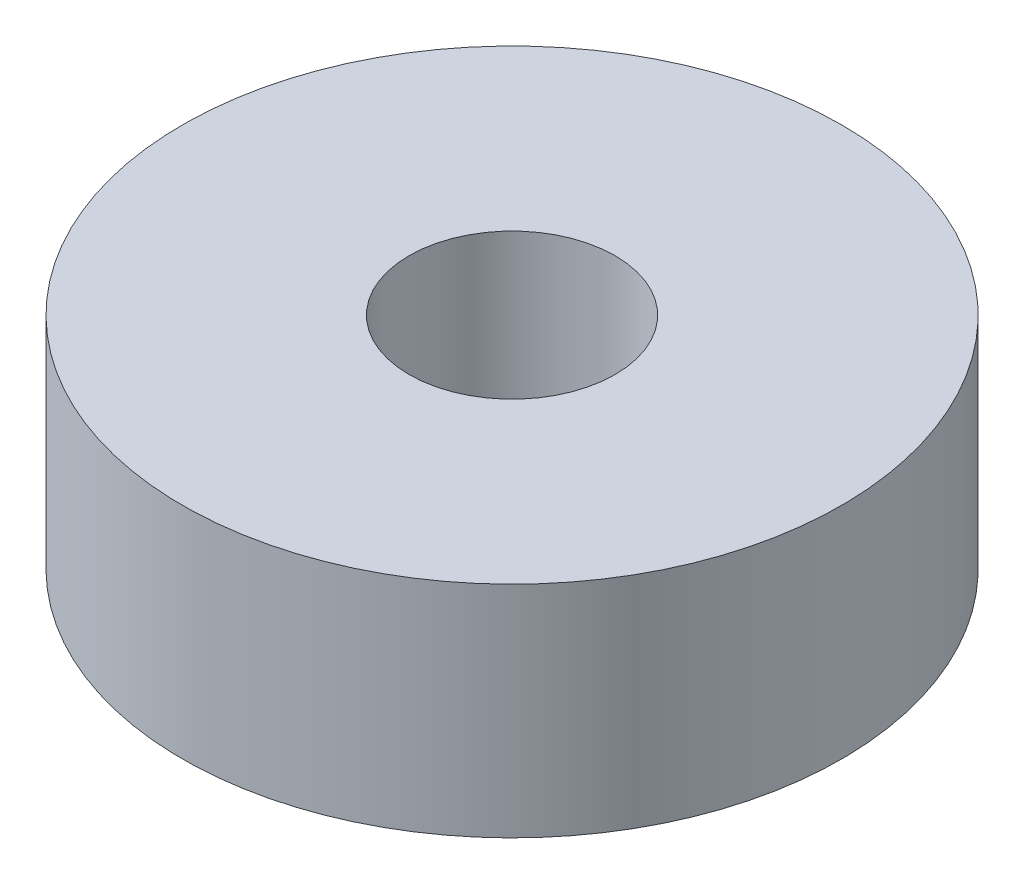
ISO-10303-21;
HEADER;
FILE_DESCRIPTION(('STEP AP214'),'2;1');
FILE_NAME('part.step','',(''),(''),'','','');
FILE_SCHEMA(('AUTOMOTIVE_DESIGN { 1 0 10303 214 1 1 1 1 }'));
ENDSEC;
DATA;
#1=APPLICATION_CONTEXT('core data for automotive mechanical design processes');
#2=APPLICATION_PROTOCOL_DEFINITION('international standard','automotive_design',2000,#1);
#3=PRODUCT_CONTEXT('',#1,'mechanical');
#4=PRODUCT('Part','Part','',(#3));
#5=PRODUCT_RELATED_PRODUCT_CATEGORY('part','',(#4));
#6=PRODUCT_DEFINITION_FORMATION('','',#4);
#7=PRODUCT_DEFINITION_CONTEXT('part definition',#1,'design');
#8=PRODUCT_DEFINITION('design','',#6,#7);
#9=PRODUCT_DEFINITION_SHAPE('','',#8);
#10=(LENGTH_UNIT() NAMED_UNIT(*) SI_UNIT(.MILLI.,.METRE.));
#11=(NAMED_UNIT(*) PLANE_ANGLE_UNIT() SI_UNIT($,.RADIAN.));
#12=(NAMED_UNIT(*) SI_UNIT($,.STERADIAN.) SOLID_ANGLE_UNIT());
#13=UNCERTAINTY_MEASURE_WITH_UNIT(LENGTH_MEASURE(1.E-05),#10,'distance_accuracy_value','');
#14=(GEOMETRIC_REPRESENTATION_CONTEXT(3) GLOBAL_UNCERTAINTY_ASSIGNED_CONTEXT((#13)) GLOBAL_UNIT_ASSIGNED_CONTEXT((#10,
#11,#12)) REPRESENTATION_CONTEXT('',''));
#15=CARTESIAN_POINT('',(0.,0.,0.));
#16=DIRECTION('',(0.,0.,1.));
#17=DIRECTION('',(1.,0.,0.));
#18=AXIS2_PLACEMENT_3D('',#15,#16,#17);
#19=CARTESIAN_POINT('',(-1.5875,0.,0.));
#20=DIRECTION('',(0.,1.,0.));
#21=DIRECTION('',(0.,0.,1.));
#22=AXIS2_PLACEMENT_3D('',#19,#20,#21);
#23=PLANE('',#22);
#24=CARTESIAN_POINT('',(0.,0.,0.));
#25=DIRECTION('',(0.,-1.,0.));
#26=DIRECTION('',(0.,0.,-1.));
#27=AXIS2_PLACEMENT_3D('',#24,#25,#26);
#28=CIRCLE('',#27,1.5875);
#29=CARTESIAN_POINT('',(0.,0.,-1.5875));
#30=VERTEX_POINT('',#29);
#31=EDGE_CURVE('E54',#30,#30,#28,.T.);
#32=ORIENTED_EDGE('',*,*,#31,.F.);
#33=EDGE_LOOP('',(#32));
#34=FACE_BOUND('',#33,.T.);
#35=CARTESIAN_POINT('',(0.,0.,0.));
#36=DIRECTION('',(0.,-1.,0.));
#37=DIRECTION('',(0.,0.,-1.));
#38=AXIS2_PLACEMENT_3D('',#35,#36,#37);
#39=CIRCLE('',#38,9.525);
#40=CARTESIAN_POINT('',(0.,0.,-9.525));
#41=VERTEX_POINT('',#40);
#42=EDGE_CURVE('E10',#41,#41,#39,.T.);
#43=ORIENTED_EDGE('',*,*,#42,.T.);
#44=EDGE_LOOP('',(#43));
#45=FACE_BOUND('',#44,.T.);
#46=ADVANCED_FACE('F32',(#34,#45),#23,.F.);
#47=CARTESIAN_POINT('',(0.,0.,0.));
#48=DIRECTION('',(0.,-1.,0.));
#49=DIRECTION('',(0.,0.,-1.));
#50=AXIS2_PLACEMENT_3D('',#47,#48,#49);
#51=CYLINDRICAL_SURFACE('',#50,9.525);
#52=ORIENTED_EDGE('',*,*,#42,.F.);
#53=EDGE_LOOP('',(#52));
#54=FACE_BOUND('',#53,.T.);
#55=CARTESIAN_POINT('',(0.,6.35,0.));
#56=DIRECTION('',(0.,-1.,0.));
#57=DIRECTION('',(0.,0.,-1.));
#58=AXIS2_PLACEMENT_3D('',#55,#56,#57);
#59=CIRCLE('',#58,9.525);
#60=CARTESIAN_POINT('',(0.,6.35,-9.525));
#61=VERTEX_POINT('',#60);
#62=EDGE_CURVE('E38',#61,#61,#59,.T.);
#63=ORIENTED_EDGE('',*,*,#62,.T.);
#64=EDGE_LOOP('',(#63));
#65=FACE_BOUND('',#64,.T.);
#66=ADVANCED_FACE('F61',(#54,#65),#51,.T.);
#67=CARTESIAN_POINT('',(-9.525,6.35,0.));
#68=DIRECTION('',(0.,-1.,0.));
#69=DIRECTION('',(0.,0.,-1.));
#70=AXIS2_PLACEMENT_3D('',#67,#68,#69);
#71=PLANE('',#70);
#72=ORIENTED_EDGE('',*,*,#62,.F.);
#73=EDGE_LOOP('',(#72));
#74=FACE_BOUND('',#73,.T.);
#75=CARTESIAN_POINT('',(0.,6.35,0.));
#76=DIRECTION('',(0.,-1.,0.));
#77=DIRECTION('',(0.,0.,-1.));
#78=AXIS2_PLACEMENT_3D('',#75,#76,#77);
#79=CIRCLE('',#78,2.9765625);
#80=CARTESIAN_POINT('',(0.,6.35,-2.9765625));
#81=VERTEX_POINT('',#80);
#82=EDGE_CURVE('E42',#81,#81,#79,.T.);
#83=ORIENTED_EDGE('',*,*,#82,.T.);
#84=EDGE_LOOP('',(#83));
#85=FACE_BOUND('',#84,.T.);
#86=ADVANCED_FACE('F65',(#74,#85),#71,.F.);
#87=CARTESIAN_POINT('',(0.,0.,0.));
#88=DIRECTION('',(0.,-1.,0.));
#89=DIRECTION('',(0.,0.,-1.));
#90=AXIS2_PLACEMENT_3D('',#87,#88,#89);
#91=CYLINDRICAL_SURFACE('',#90,2.9765625);
#92=ORIENTED_EDGE('',*,*,#82,.F.);
#93=EDGE_LOOP('',(#92));
#94=FACE_BOUND('',#93,.T.);
#95=CARTESIAN_POINT('',(0.,1.5875,0.));
#96=DIRECTION('',(0.,-1.,0.));
#97=DIRECTION('',(0.,0.,-1.));
#98=AXIS2_PLACEMENT_3D('',#95,#96,#97);
#99=CIRCLE('',#98,2.9765625);
#100=CARTESIAN_POINT('',(0.,1.5875,-2.9765625));
#101=VERTEX_POINT('',#100);
#102=EDGE_CURVE('E46',#101,#101,#99,.T.);
#103=ORIENTED_EDGE('',*,*,#102,.T.);
#104=EDGE_LOOP('',(#103));
#105=FACE_BOUND('',#104,.T.);
#106=ADVANCED_FACE('F70',(#94,#105),#91,.F.);
#107=CARTESIAN_POINT('',(-2.9765625,1.5875,0.));
#108=DIRECTION('',(0.,-1.,0.));
#109=DIRECTION('',(0.,0.,-1.));
#110=AXIS2_PLACEMENT_3D('',#107,#108,#109);
#111=PLANE('',#110);
#112=ORIENTED_EDGE('',*,*,#102,.F.);
#113=EDGE_LOOP('',(#112));
#114=FACE_BOUND('',#113,.T.);
#115=CARTESIAN_POINT('',(0.,1.5875,0.));
#116=DIRECTION('',(0.,-1.,0.));
#117=DIRECTION('',(0.,0.,-1.));
#118=AXIS2_PLACEMENT_3D('',#115,#116,#117);
#119=CIRCLE('',#118,1.5875);
#120=CARTESIAN_POINT('',(0.,1.5875,-1.5875));
#121=VERTEX_POINT('',#120);
#122=EDGE_CURVE('E51',#121,#121,#119,.T.);
#123=ORIENTED_EDGE('',*,*,#122,.T.);
#124=EDGE_LOOP('',(#123));
#125=FACE_BOUND('',#124,.T.);
#126=ADVANCED_FACE('F76',(#114,#125),#111,.F.);
#127=CARTESIAN_POINT('',(0.,0.,0.));
#128=DIRECTION('',(0.,-1.,0.));
#129=DIRECTION('',(0.,0.,-1.));
#130=AXIS2_PLACEMENT_3D('',#127,#128,#129);
#131=CYLINDRICAL_SURFACE('',#130,1.5875);
#132=ORIENTED_EDGE('',*,*,#122,.F.);
#133=EDGE_LOOP('',(#132));
#134=FACE_BOUND('',#133,.T.);
#135=ORIENTED_EDGE('',*,*,#31,.T.);
#136=EDGE_LOOP('',(#135));
#137=FACE_BOUND('',#136,.T.);
#138=ADVANCED_FACE('F58',(#134,#137),#131,.F.);
#139=CLOSED_SHELL('',(#46,#66,#86,#106,#126,#138));
#140=MANIFOLD_SOLID_BREP('B2',#139);
#141=ADVANCED_BREP_SHAPE_REPRESENTATION('',(#18,#140),#14);
#142=SHAPE_DEFINITION_REPRESENTATION(#9,#141);
ENDSEC;
END-ISO-10303-21;
